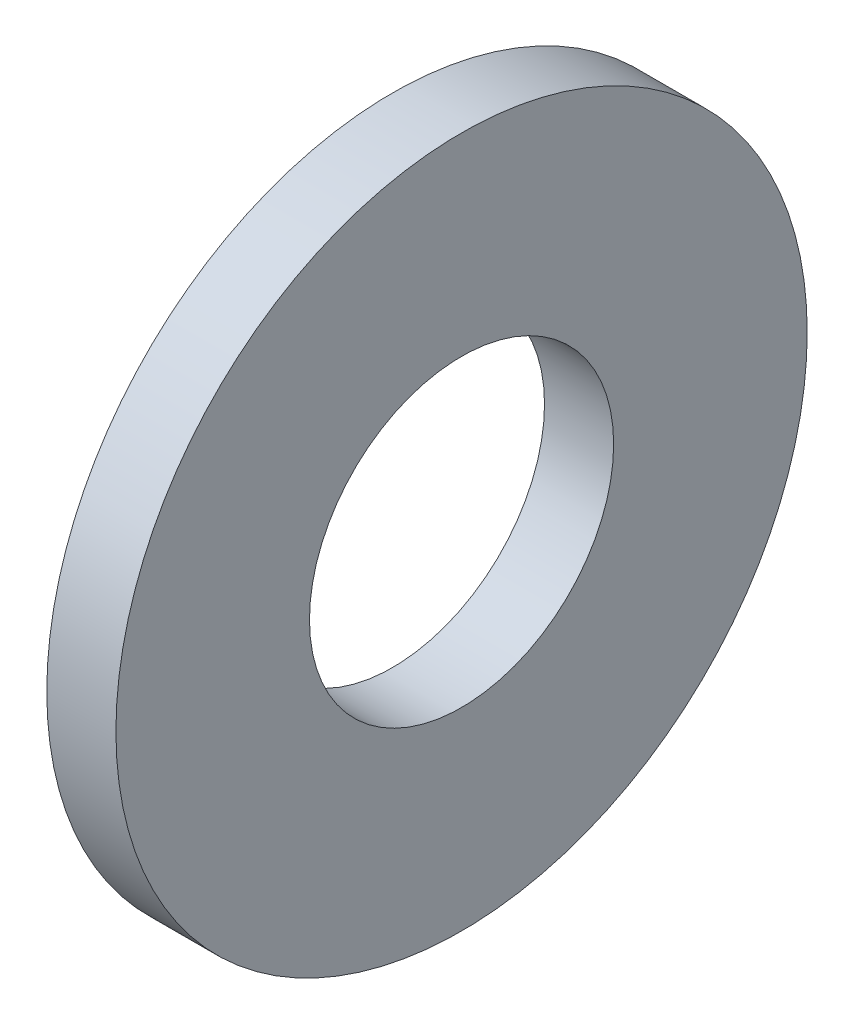
ISO-10303-21;
HEADER;
FILE_DESCRIPTION(('STEP AP214'),'2;1');
FILE_NAME('part.step','',(''),(''),'','','');
FILE_SCHEMA(('AUTOMOTIVE_DESIGN { 1 0 10303 214 1 1 1 1 }'));
ENDSEC;
DATA;
#1=APPLICATION_CONTEXT('core data for automotive mechanical design processes');
#2=APPLICATION_PROTOCOL_DEFINITION('international standard','automotive_design',2000,#1);
#3=PRODUCT_CONTEXT('',#1,'mechanical');
#4=PRODUCT('Part','Part','',(#3));
#5=PRODUCT_RELATED_PRODUCT_CATEGORY('part','',(#4));
#6=PRODUCT_DEFINITION_FORMATION('','',#4);
#7=PRODUCT_DEFINITION_CONTEXT('part definition',#1,'design');
#8=PRODUCT_DEFINITION('design','',#6,#7);
#9=PRODUCT_DEFINITION_SHAPE('','',#8);
#10=(LENGTH_UNIT() NAMED_UNIT(*) SI_UNIT(.MILLI.,.METRE.));
#11=(NAMED_UNIT(*) PLANE_ANGLE_UNIT() SI_UNIT($,.RADIAN.));
#12=(NAMED_UNIT(*) SI_UNIT($,.STERADIAN.) SOLID_ANGLE_UNIT());
#13=UNCERTAINTY_MEASURE_WITH_UNIT(LENGTH_MEASURE(1.E-05),#10,'distance_accuracy_value','');
#14=(GEOMETRIC_REPRESENTATION_CONTEXT(3) GLOBAL_UNCERTAINTY_ASSIGNED_CONTEXT((#13)) GLOBAL_UNIT_ASSIGNED_CONTEXT((#10,
#11,#12)) REPRESENTATION_CONTEXT('',''));
#15=CARTESIAN_POINT('',(0.,0.,0.));
#16=DIRECTION('',(0.,0.,1.));
#17=DIRECTION('',(1.,0.,0.));
#18=AXIS2_PLACEMENT_3D('',#15,#16,#17);
#19=CARTESIAN_POINT('',(2.,0.,0.));
#20=DIRECTION('',(1.,0.,0.));
#21=DIRECTION('',(0.,0.,-1.));
#22=AXIS2_PLACEMENT_3D('',#19,#20,#21);
#23=PLANE('',#22);
#24=CARTESIAN_POINT('',(2.,0.,0.));
#25=DIRECTION('',(1.,0.,0.));
#26=DIRECTION('',(0.,0.,-1.));
#27=AXIS2_PLACEMENT_3D('',#24,#25,#26);
#28=CIRCLE('',#27,10.);
#29=CARTESIAN_POINT('',(2.,0.,-10.));
#30=VERTEX_POINT('',#29);
#31=EDGE_CURVE('E10',#30,#30,#28,.T.);
#32=ORIENTED_EDGE('',*,*,#31,.T.);
#33=EDGE_LOOP('',(#32));
#34=FACE_BOUND('',#33,.T.);
#35=CARTESIAN_POINT('',(2.,0.,0.));
#36=DIRECTION('',(1.,0.,0.));
#37=DIRECTION('',(0.,0.,-1.));
#38=AXIS2_PLACEMENT_3D('',#35,#36,#37);
#39=CIRCLE('',#38,4.4);
#40=CARTESIAN_POINT('',(2.,0.,-4.4));
#41=VERTEX_POINT('',#40);
#42=EDGE_CURVE('E41',#41,#41,#39,.T.);
#43=ORIENTED_EDGE('',*,*,#42,.F.);
#44=EDGE_LOOP('',(#43));
#45=FACE_BOUND('',#44,.T.);
#46=ADVANCED_FACE('F30',(#34,#45),#23,.T.);
#47=CARTESIAN_POINT('',(0.,0.,0.));
#48=DIRECTION('',(1.,0.,0.));
#49=DIRECTION('',(0.,0.,-1.));
#50=AXIS2_PLACEMENT_3D('',#47,#48,#49);
#51=PLANE('',#50);
#52=CARTESIAN_POINT('',(0.,0.,0.));
#53=DIRECTION('',(1.,0.,0.));
#54=DIRECTION('',(0.,0.,-1.));
#55=AXIS2_PLACEMENT_3D('',#52,#53,#54);
#56=CIRCLE('',#55,10.);
#57=CARTESIAN_POINT('',(0.,0.,-10.));
#58=VERTEX_POINT('',#57);
#59=EDGE_CURVE('E34',#58,#58,#56,.T.);
#60=ORIENTED_EDGE('',*,*,#59,.F.);
#61=EDGE_LOOP('',(#60));
#62=FACE_BOUND('',#61,.T.);
#63=CARTESIAN_POINT('',(0.,0.,0.));
#64=DIRECTION('',(1.,0.,0.));
#65=DIRECTION('',(0.,0.,-1.));
#66=AXIS2_PLACEMENT_3D('',#63,#64,#65);
#67=CIRCLE('',#66,4.4);
#68=CARTESIAN_POINT('',(0.,0.,-4.4));
#69=VERTEX_POINT('',#68);
#70=EDGE_CURVE('E43',#69,#69,#67,.T.);
#71=ORIENTED_EDGE('',*,*,#70,.T.);
#72=EDGE_LOOP('',(#71));
#73=FACE_BOUND('',#72,.T.);
#74=ADVANCED_FACE('F53',(#62,#73),#51,.F.);
#75=CARTESIAN_POINT('',(2.,0.,0.));
#76=DIRECTION('',(-1.,0.,0.));
#77=DIRECTION('',(0.,0.,1.));
#78=AXIS2_PLACEMENT_3D('',#75,#76,#77);
#79=CYLINDRICAL_SURFACE('',#78,10.);
#80=ORIENTED_EDGE('',*,*,#31,.F.);
#81=EDGE_LOOP('',(#80));
#82=FACE_BOUND('',#81,.T.);
#83=ORIENTED_EDGE('',*,*,#59,.T.);
#84=EDGE_LOOP('',(#83));
#85=FACE_BOUND('',#84,.T.);
#86=ADVANCED_FACE('F32',(#82,#85),#79,.T.);
#87=CARTESIAN_POINT('',(2.,0.,0.));
#88=DIRECTION('',(-1.,0.,0.));
#89=DIRECTION('',(0.,0.,1.));
#90=AXIS2_PLACEMENT_3D('',#87,#88,#89);
#91=CYLINDRICAL_SURFACE('',#90,4.4);
#92=ORIENTED_EDGE('',*,*,#42,.T.);
#93=EDGE_LOOP('',(#92));
#94=FACE_BOUND('',#93,.T.);
#95=ORIENTED_EDGE('',*,*,#70,.F.);
#96=EDGE_LOOP('',(#95));
#97=FACE_BOUND('',#96,.T.);
#98=ADVANCED_FACE('F49',(#94,#97),#91,.F.);
#99=CLOSED_SHELL('',(#46,#74,#86,#98));
#100=MANIFOLD_SOLID_BREP('B2',#99);
#101=ADVANCED_BREP_SHAPE_REPRESENTATION('',(#18,#100),#14);
#102=SHAPE_DEFINITION_REPRESENTATION(#9,#101);
ENDSEC;
END-ISO-10303-21;
